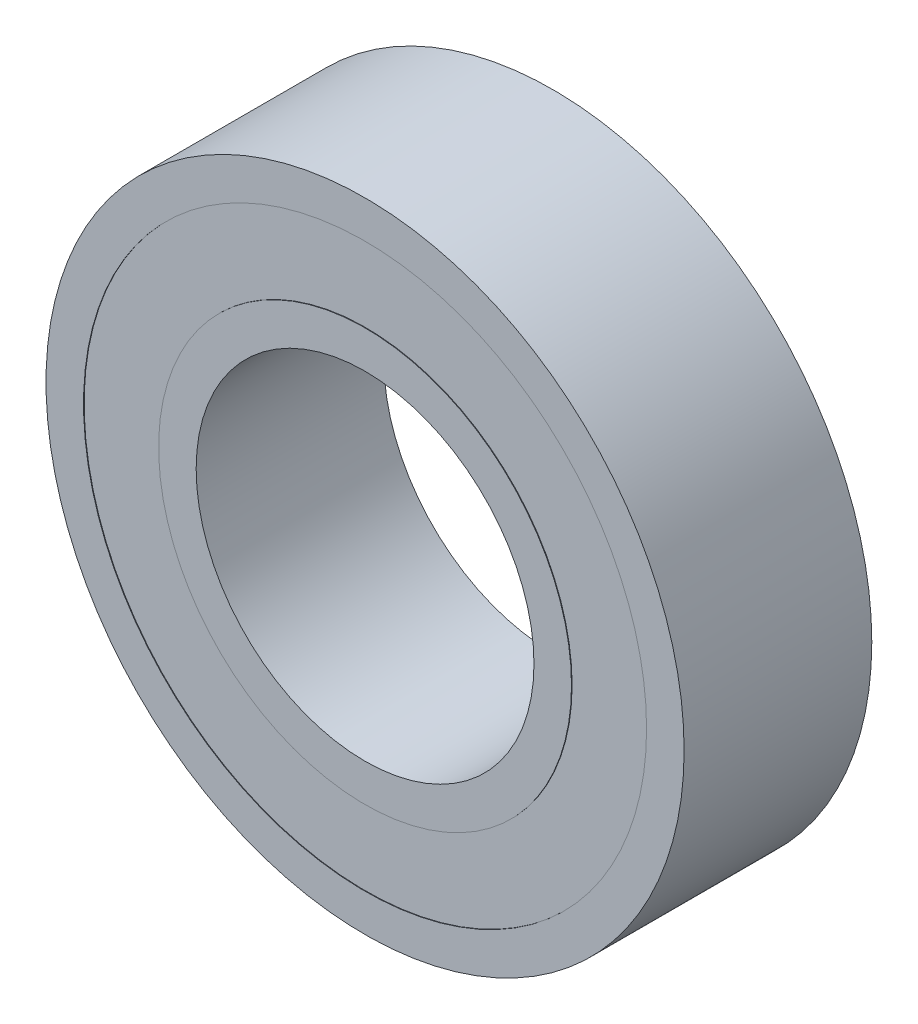
ISO-10303-21;
HEADER;
FILE_DESCRIPTION(('STEP AP214'),'2;1');
FILE_NAME('part.step','',(''),(''),'','','');
FILE_SCHEMA(('AUTOMOTIVE_DESIGN { 1 0 10303 214 1 1 1 1 }'));
ENDSEC;
DATA;
#1=APPLICATION_CONTEXT('core data for automotive mechanical design processes');
#2=APPLICATION_PROTOCOL_DEFINITION('international standard','automotive_design',2000,#1);
#3=PRODUCT_CONTEXT('',#1,'mechanical');
#4=PRODUCT('Part','Part','',(#3));
#5=PRODUCT_RELATED_PRODUCT_CATEGORY('part','',(#4));
#6=PRODUCT_DEFINITION_FORMATION('','',#4);
#7=PRODUCT_DEFINITION_CONTEXT('part definition',#1,'design');
#8=PRODUCT_DEFINITION('design','',#6,#7);
#9=PRODUCT_DEFINITION_SHAPE('','',#8);
#10=(LENGTH_UNIT() NAMED_UNIT(*) SI_UNIT(.MILLI.,.METRE.));
#11=(NAMED_UNIT(*) PLANE_ANGLE_UNIT() SI_UNIT($,.RADIAN.));
#12=(NAMED_UNIT(*) SI_UNIT($,.STERADIAN.) SOLID_ANGLE_UNIT());
#13=UNCERTAINTY_MEASURE_WITH_UNIT(LENGTH_MEASURE(1.E-05),#10,'distance_accuracy_value','');
#14=(GEOMETRIC_REPRESENTATION_CONTEXT(3) GLOBAL_UNCERTAINTY_ASSIGNED_CONTEXT((#13)) GLOBAL_UNIT_ASSIGNED_CONTEXT((#10,
#11,#12)) REPRESENTATION_CONTEXT('',''));
#15=CARTESIAN_POINT('',(0.,0.,0.));
#16=DIRECTION('',(0.,0.,1.));
#17=DIRECTION('',(1.,0.,0.));
#18=AXIS2_PLACEMENT_3D('',#15,#16,#17);
#19=CARTESIAN_POINT('',(0.,0.,-2.5));
#20=DIRECTION('',(0.,0.,1.));
#21=DIRECTION('',(1.,0.,0.));
#22=AXIS2_PLACEMENT_3D('',#19,#20,#21);
#23=CYLINDRICAL_SURFACE('',#22,7.5);
#24=CARTESIAN_POINT('',(0.,0.,-2.5));
#25=DIRECTION('',(0.,0.,1.));
#26=DIRECTION('',(1.,0.,0.));
#27=AXIS2_PLACEMENT_3D('',#24,#25,#26);
#28=CIRCLE('',#27,7.5);
#29=CARTESIAN_POINT('',(7.5,0.,-2.5));
#30=VERTEX_POINT('',#29);
#31=EDGE_CURVE('E60',#30,#30,#28,.T.);
#32=ORIENTED_EDGE('',*,*,#31,.F.);
#33=EDGE_LOOP('',(#32));
#34=FACE_BOUND('',#33,.T.);
#35=CARTESIAN_POINT('',(0.,0.,-2.484375));
#36=DIRECTION('',(0.,0.,1.));
#37=DIRECTION('',(1.,0.,0.));
#38=AXIS2_PLACEMENT_3D('',#35,#36,#37);
#39=CIRCLE('',#38,7.5);
#40=CARTESIAN_POINT('',(7.5,0.,-2.484375));
#41=VERTEX_POINT('',#40);
#42=EDGE_CURVE('E11',#41,#41,#39,.F.);
#43=ORIENTED_EDGE('',*,*,#42,.F.);
#44=EDGE_LOOP('',(#43));
#45=FACE_BOUND('',#44,.T.);
#46=ADVANCED_FACE('F49',(#34,#45),#23,.F.);
#47=CARTESIAN_POINT('',(0.,0.,2.484375));
#48=DIRECTION('',(0.,0.,1.));
#49=DIRECTION('',(1.,0.,0.));
#50=AXIS2_PLACEMENT_3D('',#47,#48,#49);
#51=CIRCLE('',#50,7.5);
#52=CARTESIAN_POINT('',(7.5,0.,2.484375));
#53=VERTEX_POINT('',#52);
#54=EDGE_CURVE('E72',#53,#53,#51,.T.);
#55=ORIENTED_EDGE('',*,*,#54,.F.);
#56=EDGE_LOOP('',(#55));
#57=FACE_BOUND('',#56,.T.);
#58=CARTESIAN_POINT('',(0.,0.,2.5));
#59=DIRECTION('',(0.,0.,1.));
#60=DIRECTION('',(1.,0.,0.));
#61=AXIS2_PLACEMENT_3D('',#58,#59,#60);
#62=CIRCLE('',#61,7.5);
#63=CARTESIAN_POINT('',(7.5,0.,2.5));
#64=VERTEX_POINT('',#63);
#65=EDGE_CURVE('E69',#64,#64,#62,.T.);
#66=ORIENTED_EDGE('',*,*,#65,.T.);
#67=EDGE_LOOP('',(#66));
#68=FACE_BOUND('',#67,.T.);
#69=ADVANCED_FACE('F51',(#57,#68),#23,.F.);
#70=CARTESIAN_POINT('',(0.,0.,-2.5));
#71=DIRECTION('',(0.,0.,1.));
#72=DIRECTION('',(1.,0.,0.));
#73=AXIS2_PLACEMENT_3D('',#70,#71,#72);
#74=CYLINDRICAL_SURFACE('',#73,8.5);
#75=CARTESIAN_POINT('',(0.,0.,-2.5));
#76=DIRECTION('',(0.,0.,1.));
#77=DIRECTION('',(1.,0.,0.));
#78=AXIS2_PLACEMENT_3D('',#75,#76,#77);
#79=CIRCLE('',#78,8.5);
#80=CARTESIAN_POINT('',(8.5,0.,-2.5));
#81=VERTEX_POINT('',#80);
#82=EDGE_CURVE('E56',#81,#81,#79,.T.);
#83=ORIENTED_EDGE('',*,*,#82,.T.);
#84=EDGE_LOOP('',(#83));
#85=FACE_BOUND('',#84,.T.);
#86=CARTESIAN_POINT('',(0.,0.,2.5));
#87=DIRECTION('',(0.,0.,1.));
#88=DIRECTION('',(1.,0.,0.));
#89=AXIS2_PLACEMENT_3D('',#86,#87,#88);
#90=CIRCLE('',#89,8.5);
#91=CARTESIAN_POINT('',(8.5,0.,2.5));
#92=VERTEX_POINT('',#91);
#93=EDGE_CURVE('E64',#92,#92,#90,.T.);
#94=ORIENTED_EDGE('',*,*,#93,.F.);
#95=EDGE_LOOP('',(#94));
#96=FACE_BOUND('',#95,.T.);
#97=ADVANCED_FACE('F124',(#85,#96),#74,.T.);
#98=CARTESIAN_POINT('',(0.,0.,-2.5));
#99=DIRECTION('',(0.,0.,1.));
#100=DIRECTION('',(1.,0.,0.));
#101=AXIS2_PLACEMENT_3D('',#98,#99,#100);
#102=PLANE('',#101);
#103=ORIENTED_EDGE('',*,*,#31,.T.);
#104=EDGE_LOOP('',(#103));
#105=FACE_BOUND('',#104,.T.);
#106=ORIENTED_EDGE('',*,*,#82,.F.);
#107=EDGE_LOOP('',(#106));
#108=FACE_BOUND('',#107,.T.);
#109=ADVANCED_FACE('F129',(#105,#108),#102,.F.);
#110=CARTESIAN_POINT('',(0.,0.,2.5));
#111=DIRECTION('',(0.,0.,1.));
#112=DIRECTION('',(1.,0.,0.));
#113=AXIS2_PLACEMENT_3D('',#110,#111,#112);
#114=PLANE('',#113);
#115=ORIENTED_EDGE('',*,*,#65,.F.);
#116=EDGE_LOOP('',(#115));
#117=FACE_BOUND('',#116,.T.);
#118=ORIENTED_EDGE('',*,*,#93,.T.);
#119=EDGE_LOOP('',(#118));
#120=FACE_BOUND('',#119,.T.);
#121=ADVANCED_FACE('F132',(#117,#120),#114,.T.);
#122=CARTESIAN_POINT('',(0.,0.,-2.484375));
#123=DIRECTION('',(0.,0.,1.));
#124=DIRECTION('',(1.,0.,0.));
#125=AXIS2_PLACEMENT_3D('',#122,#123,#124);
#126=PLANE('',#125);
#127=CARTESIAN_POINT('',(0.,0.,-2.484375));
#128=DIRECTION('',(0.,0.,1.));
#129=DIRECTION('',(1.,0.,0.));
#130=AXIS2_PLACEMENT_3D('',#127,#128,#129);
#131=CIRCLE('',#130,5.5);
#132=CARTESIAN_POINT('',(5.5,0.,-2.484375));
#133=VERTEX_POINT('',#132);
#134=EDGE_CURVE('E78',#133,#133,#131,.T.);
#135=ORIENTED_EDGE('',*,*,#134,.T.);
#136=EDGE_LOOP('',(#135));
#137=FACE_BOUND('',#136,.T.);
#138=ORIENTED_EDGE('',*,*,#42,.T.);
#139=EDGE_LOOP('',(#138));
#140=FACE_BOUND('',#139,.T.);
#141=ADVANCED_FACE('F138',(#137,#140),#126,.F.);
#142=CARTESIAN_POINT('',(0.,0.,2.484375));
#143=DIRECTION('',(0.,0.,1.));
#144=DIRECTION('',(1.,0.,0.));
#145=AXIS2_PLACEMENT_3D('',#142,#143,#144);
#146=PLANE('',#145);
#147=CARTESIAN_POINT('',(0.,0.,2.484375));
#148=DIRECTION('',(0.,0.,1.));
#149=DIRECTION('',(1.,0.,0.));
#150=AXIS2_PLACEMENT_3D('',#147,#148,#149);
#151=CIRCLE('',#150,5.5);
#152=CARTESIAN_POINT('',(5.5,0.,2.484375));
#153=VERTEX_POINT('',#152);
#154=EDGE_CURVE('E75',#153,#153,#151,.T.);
#155=ORIENTED_EDGE('',*,*,#154,.F.);
#156=EDGE_LOOP('',(#155));
#157=FACE_BOUND('',#156,.T.);
#158=ORIENTED_EDGE('',*,*,#54,.T.);
#159=EDGE_LOOP('',(#158));
#160=FACE_BOUND('',#159,.T.);
#161=ADVANCED_FACE('F117',(#157,#160),#146,.T.);
#162=CARTESIAN_POINT('',(0.,0.,-2.5));
#163=DIRECTION('',(0.,0.,1.));
#164=DIRECTION('',(1.,0.,0.));
#165=AXIS2_PLACEMENT_3D('',#162,#163,#164);
#166=CYLINDRICAL_SURFACE('',#165,5.5);
#167=CARTESIAN_POINT('',(0.,0.,-2.5));
#168=DIRECTION('',(0.,0.,1.));
#169=DIRECTION('',(1.,0.,0.));
#170=AXIS2_PLACEMENT_3D('',#167,#168,#169);
#171=CIRCLE('',#170,5.5);
#172=CARTESIAN_POINT('',(5.5,0.,-2.5));
#173=VERTEX_POINT('',#172);
#174=EDGE_CURVE('E81',#173,#173,#171,.T.);
#175=ORIENTED_EDGE('',*,*,#174,.T.);
#176=EDGE_LOOP('',(#175));
#177=FACE_BOUND('',#176,.T.);
#178=ORIENTED_EDGE('',*,*,#134,.F.);
#179=EDGE_LOOP('',(#178));
#180=FACE_BOUND('',#179,.T.);
#181=ADVANCED_FACE('F107',(#177,#180),#166,.T.);
#182=CARTESIAN_POINT('',(0.,0.,-2.5));
#183=DIRECTION('',(0.,0.,1.));
#184=DIRECTION('',(1.,0.,0.));
#185=AXIS2_PLACEMENT_3D('',#182,#183,#184);
#186=CYLINDRICAL_SURFACE('',#185,4.5);
#187=CARTESIAN_POINT('',(0.,0.,-2.5));
#188=DIRECTION('',(0.,0.,1.));
#189=DIRECTION('',(1.,0.,0.));
#190=AXIS2_PLACEMENT_3D('',#187,#188,#189);
#191=CIRCLE('',#190,4.5);
#192=CARTESIAN_POINT('',(4.5,0.,-2.5));
#193=VERTEX_POINT('',#192);
#194=EDGE_CURVE('E84',#193,#193,#191,.T.);
#195=ORIENTED_EDGE('',*,*,#194,.F.);
#196=EDGE_LOOP('',(#195));
#197=FACE_BOUND('',#196,.T.);
#198=CARTESIAN_POINT('',(0.,0.,2.5));
#199=DIRECTION('',(0.,0.,1.));
#200=DIRECTION('',(1.,0.,0.));
#201=AXIS2_PLACEMENT_3D('',#198,#199,#200);
#202=CIRCLE('',#201,4.5);
#203=CARTESIAN_POINT('',(4.5,0.,2.5));
#204=VERTEX_POINT('',#203);
#205=EDGE_CURVE('E90',#204,#204,#202,.T.);
#206=ORIENTED_EDGE('',*,*,#205,.T.);
#207=EDGE_LOOP('',(#206));
#208=FACE_BOUND('',#207,.T.);
#209=ADVANCED_FACE('F94',(#197,#208),#186,.F.);
#210=ORIENTED_EDGE('',*,*,#154,.T.);
#211=EDGE_LOOP('',(#210));
#212=FACE_BOUND('',#211,.T.);
#213=CARTESIAN_POINT('',(0.,0.,2.5));
#214=DIRECTION('',(0.,0.,1.));
#215=DIRECTION('',(1.,0.,0.));
#216=AXIS2_PLACEMENT_3D('',#213,#214,#215);
#217=CIRCLE('',#216,5.5);
#218=CARTESIAN_POINT('',(5.5,0.,2.5));
#219=VERTEX_POINT('',#218);
#220=EDGE_CURVE('E87',#219,#219,#217,.T.);
#221=ORIENTED_EDGE('',*,*,#220,.F.);
#222=EDGE_LOOP('',(#221));
#223=FACE_BOUND('',#222,.T.);
#224=ADVANCED_FACE('F103',(#212,#223),#166,.T.);
#225=CARTESIAN_POINT('',(0.,0.,-2.5));
#226=DIRECTION('',(0.,0.,1.));
#227=DIRECTION('',(1.,0.,0.));
#228=AXIS2_PLACEMENT_3D('',#225,#226,#227);
#229=PLANE('',#228);
#230=ORIENTED_EDGE('',*,*,#194,.T.);
#231=EDGE_LOOP('',(#230));
#232=FACE_BOUND('',#231,.T.);
#233=ORIENTED_EDGE('',*,*,#174,.F.);
#234=EDGE_LOOP('',(#233));
#235=FACE_BOUND('',#234,.T.);
#236=ADVANCED_FACE('F99',(#232,#235),#229,.F.);
#237=CARTESIAN_POINT('',(0.,0.,2.5));
#238=DIRECTION('',(0.,0.,1.));
#239=DIRECTION('',(1.,0.,0.));
#240=AXIS2_PLACEMENT_3D('',#237,#238,#239);
#241=PLANE('',#240);
#242=ORIENTED_EDGE('',*,*,#205,.F.);
#243=EDGE_LOOP('',(#242));
#244=FACE_BOUND('',#243,.T.);
#245=ORIENTED_EDGE('',*,*,#220,.T.);
#246=EDGE_LOOP('',(#245));
#247=FACE_BOUND('',#246,.T.);
#248=ADVANCED_FACE('F96',(#244,#247),#241,.T.);
#249=CLOSED_SHELL('',(#46,#69,#97,#109,#121,#141,#161,#181,#209,#224,#236,#248));
#250=MANIFOLD_SOLID_BREP('B2',#249);
#251=ADVANCED_BREP_SHAPE_REPRESENTATION('',(#18,#250),#14);
#252=SHAPE_DEFINITION_REPRESENTATION(#9,#251);
ENDSEC;
END-ISO-10303-21;
